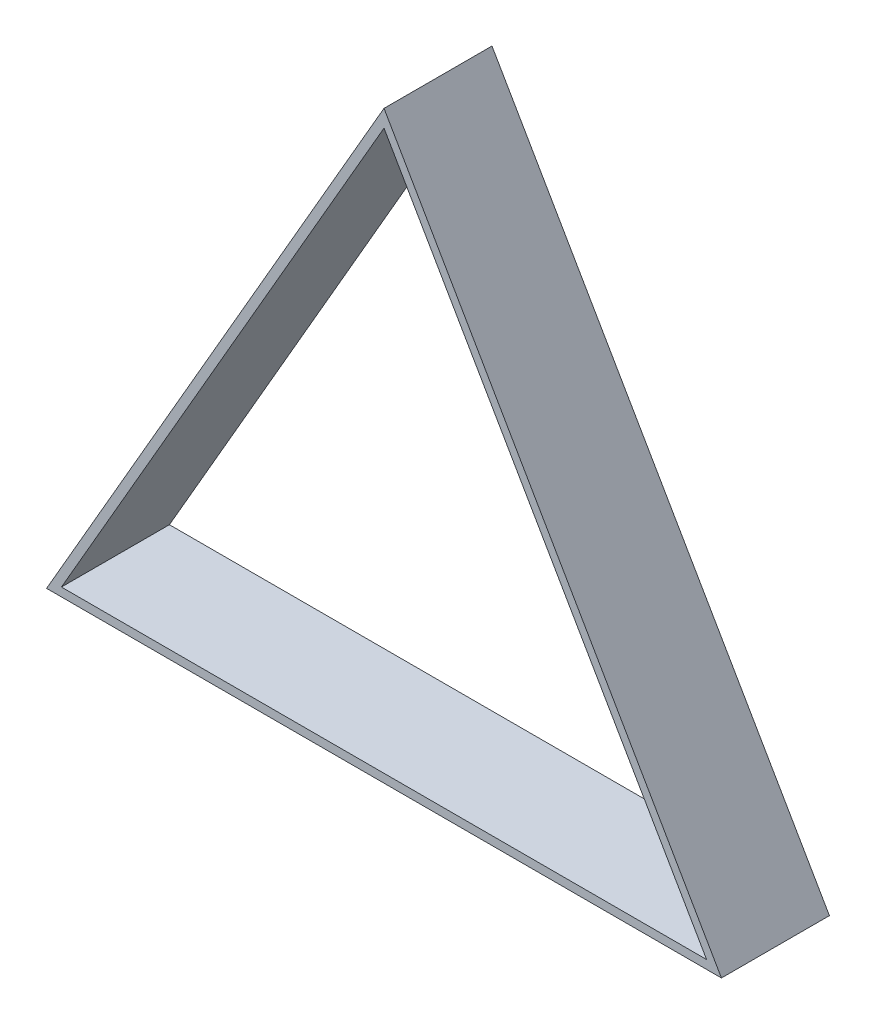
ISO-10303-21;
HEADER;
FILE_DESCRIPTION(('STEP AP214'),'2;1');
FILE_NAME('part.step','',(''),(''),'','','');
FILE_SCHEMA(('AUTOMOTIVE_DESIGN { 1 0 10303 214 1 1 1 1 }'));
ENDSEC;
DATA;
#1=APPLICATION_CONTEXT('core data for automotive mechanical design processes');
#2=APPLICATION_PROTOCOL_DEFINITION('international standard','automotive_design',2000,#1);
#3=PRODUCT_CONTEXT('',#1,'mechanical');
#4=PRODUCT('Part','Part','',(#3));
#5=PRODUCT_RELATED_PRODUCT_CATEGORY('part','',(#4));
#6=PRODUCT_DEFINITION_FORMATION('','',#4);
#7=PRODUCT_DEFINITION_CONTEXT('part definition',#1,'design');
#8=PRODUCT_DEFINITION('design','',#6,#7);
#9=PRODUCT_DEFINITION_SHAPE('','',#8);
#10=(LENGTH_UNIT() NAMED_UNIT(*) SI_UNIT(.MILLI.,.METRE.));
#11=(NAMED_UNIT(*) PLANE_ANGLE_UNIT() SI_UNIT($,.RADIAN.));
#12=(NAMED_UNIT(*) SI_UNIT($,.STERADIAN.) SOLID_ANGLE_UNIT());
#13=UNCERTAINTY_MEASURE_WITH_UNIT(LENGTH_MEASURE(1.E-05),#10,'distance_accuracy_value','');
#14=(GEOMETRIC_REPRESENTATION_CONTEXT(3) GLOBAL_UNCERTAINTY_ASSIGNED_CONTEXT((#13)) GLOBAL_UNIT_ASSIGNED_CONTEXT((#10,
#11,#12)) REPRESENTATION_CONTEXT('',''));
#15=CARTESIAN_POINT('',(0.,0.,0.));
#16=DIRECTION('',(0.,0.,1.));
#17=DIRECTION('',(1.,0.,0.));
#18=AXIS2_PLACEMENT_3D('',#15,#16,#17);
#19=CARTESIAN_POINT('',(0.,0.,40.));
#20=DIRECTION('',(0.,0.,-1.));
#21=DIRECTION('',(-1.,0.,0.));
#22=AXIS2_PLACEMENT_3D('',#19,#20,#21);
#23=PLANE('',#22);
#24=DIRECTION('',(1.,0.,0.));
#25=VECTOR('',#24,1.);
#26=CARTESIAN_POINT('',(249.999999999999,-8.42792467102253E-13,40.));
#27=LINE('',#26,#25);
#28=CARTESIAN_POINT('',(0.,0.,40.));
#29=VERTEX_POINT('',#28);
#30=CARTESIAN_POINT('',(249.999999999999,-8.42792467102253E-13,40.));
#31=VERTEX_POINT('',#30);
#32=EDGE_CURVE('E115',#29,#31,#27,.T.);
#33=ORIENTED_EDGE('',*,*,#32,.T.);
#34=DIRECTION('',(-0.499999999999991,0.866025403784444,0.));
#35=VECTOR('',#34,1.);
#36=CARTESIAN_POINT('',(125.000000000002,216.50635094611,40.));
#37=LINE('',#36,#35);
#38=CARTESIAN_POINT('',(125.000000000002,216.50635094611,40.));
#39=VERTEX_POINT('',#38);
#40=EDGE_CURVE('E118',#31,#39,#37,.T.);
#41=ORIENTED_EDGE('',*,*,#40,.T.);
#42=DIRECTION('',(-0.500000000000004,-0.866025403784436,0.));
#43=VECTOR('',#42,1.);
#44=CARTESIAN_POINT('',(0.,0.,40.));
#45=LINE('',#44,#43);
#46=EDGE_CURVE('E121',#39,#29,#45,.T.);
#47=ORIENTED_EDGE('',*,*,#46,.T.);
#48=EDGE_LOOP('',(#33,#41,#47));
#49=FACE_BOUND('',#48,.T.);
#50=DIRECTION('',(-0.499999999999992,0.866025403784444,0.));
#51=VECTOR('',#50,1.);
#52=CARTESIAN_POINT('',(244.500738685968,3.17499999999997,40.));
#53=LINE('',#52,#51);
#54=CARTESIAN_POINT('',(244.500738685968,3.17499999999997,40.));
#55=VERTEX_POINT('',#54);
#56=CARTESIAN_POINT('',(125.000000000002,210.15635094611,40.));
#57=VERTEX_POINT('',#56);
#58=EDGE_CURVE('E88',#55,#57,#53,.T.);
#59=ORIENTED_EDGE('',*,*,#58,.F.);
#60=DIRECTION('',(1.,0.,0.));
#61=VECTOR('',#60,1.);
#62=CARTESIAN_POINT('',(5.49926131403124,3.17499999999998,40.));
#63=LINE('',#62,#61);
#64=CARTESIAN_POINT('',(5.49926131403124,3.17499999999998,40.));
#65=VERTEX_POINT('',#64);
#66=EDGE_CURVE('E105',#65,#55,#63,.T.);
#67=ORIENTED_EDGE('',*,*,#66,.F.);
#68=DIRECTION('',(-0.500000000000004,-0.866025403784436,0.));
#69=VECTOR('',#68,1.);
#70=CARTESIAN_POINT('',(125.000000000002,210.15635094611,40.));
#71=LINE('',#70,#69);
#72=EDGE_CURVE('E96',#57,#65,#71,.T.);
#73=ORIENTED_EDGE('',*,*,#72,.F.);
#74=EDGE_LOOP('',(#59,#67,#73));
#75=FACE_BOUND('',#74,.T.);
#76=ADVANCED_FACE('F35',(#49,#75),#23,.F.);
#77=CARTESIAN_POINT('',(0.,0.,0.));
#78=DIRECTION('',(0.,0.,-1.));
#79=DIRECTION('',(-1.,0.,0.));
#80=AXIS2_PLACEMENT_3D('',#77,#78,#79);
#81=PLANE('',#80);
#82=DIRECTION('',(1.,0.,0.));
#83=VECTOR('',#82,1.);
#84=CARTESIAN_POINT('',(249.999999999999,-8.42792467102253E-13,0.));
#85=LINE('',#84,#83);
#86=CARTESIAN_POINT('',(0.,0.,0.));
#87=VERTEX_POINT('',#86);
#88=CARTESIAN_POINT('',(249.999999999999,-8.42792467102253E-13,0.));
#89=VERTEX_POINT('',#88);
#90=EDGE_CURVE('E103',#87,#89,#85,.T.);
#91=ORIENTED_EDGE('',*,*,#90,.F.);
#92=DIRECTION('',(-0.500000000000004,-0.866025403784436,0.));
#93=VECTOR('',#92,1.);
#94=CARTESIAN_POINT('',(0.,0.,0.));
#95=LINE('',#94,#93);
#96=CARTESIAN_POINT('',(125.000000000002,216.50635094611,0.));
#97=VERTEX_POINT('',#96);
#98=EDGE_CURVE('E119',#97,#87,#95,.T.);
#99=ORIENTED_EDGE('',*,*,#98,.F.);
#100=DIRECTION('',(-0.499999999999991,0.866025403784444,0.));
#101=VECTOR('',#100,1.);
#102=CARTESIAN_POINT('',(125.000000000002,216.50635094611,0.));
#103=LINE('',#102,#101);
#104=EDGE_CURVE('E126',#89,#97,#103,.T.);
#105=ORIENTED_EDGE('',*,*,#104,.F.);
#106=EDGE_LOOP('',(#91,#99,#105));
#107=FACE_BOUND('',#106,.T.);
#108=DIRECTION('',(1.,0.,0.));
#109=VECTOR('',#108,1.);
#110=CARTESIAN_POINT('',(5.49926131403124,3.17499999999998,0.));
#111=LINE('',#110,#109);
#112=CARTESIAN_POINT('',(5.49926131403124,3.17499999999998,0.));
#113=VERTEX_POINT('',#112);
#114=CARTESIAN_POINT('',(244.500738685968,3.17499999999997,0.));
#115=VERTEX_POINT('',#114);
#116=EDGE_CURVE('E97',#113,#115,#111,.T.);
#117=ORIENTED_EDGE('',*,*,#116,.T.);
#118=DIRECTION('',(-0.499999999999992,0.866025403784444,0.));
#119=VECTOR('',#118,1.);
#120=CARTESIAN_POINT('',(244.500738685968,3.17499999999997,0.));
#121=LINE('',#120,#119);
#122=CARTESIAN_POINT('',(125.000000000002,210.15635094611,0.));
#123=VERTEX_POINT('',#122);
#124=EDGE_CURVE('E58',#115,#123,#121,.T.);
#125=ORIENTED_EDGE('',*,*,#124,.T.);
#126=DIRECTION('',(-0.500000000000004,-0.866025403784436,0.));
#127=VECTOR('',#126,1.);
#128=CARTESIAN_POINT('',(125.000000000002,210.15635094611,0.));
#129=LINE('',#128,#127);
#130=EDGE_CURVE('E102',#123,#113,#129,.T.);
#131=ORIENTED_EDGE('',*,*,#130,.T.);
#132=EDGE_LOOP('',(#117,#125,#131));
#133=FACE_BOUND('',#132,.T.);
#134=ADVANCED_FACE('F140',(#107,#133),#81,.T.);
#135=CARTESIAN_POINT('',(249.999999999999,-8.42792467102253E-13,40.));
#136=DIRECTION('',(0.,1.,0.));
#137=DIRECTION('',(-1.,0.,0.));
#138=AXIS2_PLACEMENT_3D('',#135,#136,#137);
#139=PLANE('',#138);
#140=ORIENTED_EDGE('',*,*,#90,.T.);
#141=DIRECTION('',(0.,0.,-1.));
#142=VECTOR('',#141,1.);
#143=CARTESIAN_POINT('',(249.999999999999,-8.42792467102253E-13,40.));
#144=LINE('',#143,#142);
#145=EDGE_CURVE('E11',#31,#89,#144,.T.);
#146=ORIENTED_EDGE('',*,*,#145,.F.);
#147=ORIENTED_EDGE('',*,*,#32,.F.);
#148=DIRECTION('',(0.,0.,-1.));
#149=VECTOR('',#148,1.);
#150=CARTESIAN_POINT('',(0.,0.,40.));
#151=LINE('',#150,#149);
#152=EDGE_CURVE('E123',#29,#87,#151,.T.);
#153=ORIENTED_EDGE('',*,*,#152,.T.);
#154=EDGE_LOOP('',(#140,#146,#147,#153));
#155=FACE_BOUND('',#154,.T.);
#156=ADVANCED_FACE('F37',(#155),#139,.F.);
#157=CARTESIAN_POINT('',(125.000000000002,216.50635094611,40.));
#158=DIRECTION('',(-0.866025403784444,-0.499999999999991,0.));
#159=DIRECTION('',(0.499999999999991,-0.866025403784444,0.));
#160=AXIS2_PLACEMENT_3D('',#157,#158,#159);
#161=PLANE('',#160);
#162=ORIENTED_EDGE('',*,*,#104,.T.);
#163=DIRECTION('',(0.,0.,-1.));
#164=VECTOR('',#163,1.);
#165=CARTESIAN_POINT('',(125.000000000002,216.50635094611,40.));
#166=LINE('',#165,#164);
#167=EDGE_CURVE('E43',#39,#97,#166,.T.);
#168=ORIENTED_EDGE('',*,*,#167,.F.);
#169=ORIENTED_EDGE('',*,*,#40,.F.);
#170=ORIENTED_EDGE('',*,*,#145,.T.);
#171=EDGE_LOOP('',(#162,#168,#169,#170));
#172=FACE_BOUND('',#171,.T.);
#173=ADVANCED_FACE('F146',(#172),#161,.F.);
#174=CARTESIAN_POINT('',(0.,0.,40.));
#175=DIRECTION('',(0.866025403784436,-0.500000000000004,0.));
#176=DIRECTION('',(0.500000000000004,0.866025403784436,0.));
#177=AXIS2_PLACEMENT_3D('',#174,#175,#176);
#178=PLANE('',#177);
#179=ORIENTED_EDGE('',*,*,#98,.T.);
#180=ORIENTED_EDGE('',*,*,#152,.F.);
#181=ORIENTED_EDGE('',*,*,#46,.F.);
#182=ORIENTED_EDGE('',*,*,#167,.T.);
#183=EDGE_LOOP('',(#179,#180,#181,#182));
#184=FACE_BOUND('',#183,.T.);
#185=ADVANCED_FACE('F135',(#184),#178,.F.);
#186=CARTESIAN_POINT('',(244.500738685968,3.17499999999997,40.));
#187=DIRECTION('',(-0.866025403784444,-0.499999999999992,0.));
#188=DIRECTION('',(0.499999999999992,-0.866025403784444,0.));
#189=AXIS2_PLACEMENT_3D('',#186,#187,#188);
#190=PLANE('',#189);
#191=ORIENTED_EDGE('',*,*,#124,.F.);
#192=DIRECTION('',(0.,0.,-1.));
#193=VECTOR('',#192,1.);
#194=CARTESIAN_POINT('',(244.500738685968,3.17499999999997,40.));
#195=LINE('',#194,#193);
#196=EDGE_CURVE('E92',#55,#115,#195,.T.);
#197=ORIENTED_EDGE('',*,*,#196,.F.);
#198=ORIENTED_EDGE('',*,*,#58,.T.);
#199=DIRECTION('',(0.,0.,-1.));
#200=VECTOR('',#199,1.);
#201=CARTESIAN_POINT('',(125.000000000002,210.15635094611,40.));
#202=LINE('',#201,#200);
#203=EDGE_CURVE('E91',#57,#123,#202,.T.);
#204=ORIENTED_EDGE('',*,*,#203,.T.);
#205=EDGE_LOOP('',(#191,#197,#198,#204));
#206=FACE_BOUND('',#205,.T.);
#207=ADVANCED_FACE('F90',(#206),#190,.T.);
#208=CARTESIAN_POINT('',(125.000000000002,210.15635094611,40.));
#209=DIRECTION('',(0.866025403784436,-0.500000000000004,0.));
#210=DIRECTION('',(0.500000000000004,0.866025403784436,0.));
#211=AXIS2_PLACEMENT_3D('',#208,#209,#210);
#212=PLANE('',#211);
#213=ORIENTED_EDGE('',*,*,#130,.F.);
#214=ORIENTED_EDGE('',*,*,#203,.F.);
#215=ORIENTED_EDGE('',*,*,#72,.T.);
#216=DIRECTION('',(0.,0.,-1.));
#217=VECTOR('',#216,1.);
#218=CARTESIAN_POINT('',(5.49926131403124,3.17499999999998,40.));
#219=LINE('',#218,#217);
#220=EDGE_CURVE('E50',#65,#113,#219,.T.);
#221=ORIENTED_EDGE('',*,*,#220,.T.);
#222=EDGE_LOOP('',(#213,#214,#215,#221));
#223=FACE_BOUND('',#222,.T.);
#224=ADVANCED_FACE('F100',(#223),#212,.T.);
#225=CARTESIAN_POINT('',(5.49926131403124,3.17499999999998,40.));
#226=DIRECTION('',(0.,1.,0.));
#227=DIRECTION('',(-1.,0.,0.));
#228=AXIS2_PLACEMENT_3D('',#225,#226,#227);
#229=PLANE('',#228);
#230=ORIENTED_EDGE('',*,*,#116,.F.);
#231=ORIENTED_EDGE('',*,*,#220,.F.);
#232=ORIENTED_EDGE('',*,*,#66,.T.);
#233=ORIENTED_EDGE('',*,*,#196,.T.);
#234=EDGE_LOOP('',(#230,#231,#232,#233));
#235=FACE_BOUND('',#234,.T.);
#236=ADVANCED_FACE('F164',(#235),#229,.T.);
#237=CLOSED_SHELL('',(#76,#134,#156,#173,#185,#207,#224,#236));
#238=MANIFOLD_SOLID_BREP('B2',#237);
#239=ADVANCED_BREP_SHAPE_REPRESENTATION('',(#18,#238),#14);
#240=SHAPE_DEFINITION_REPRESENTATION(#9,#239);
ENDSEC;
END-ISO-10303-21;
